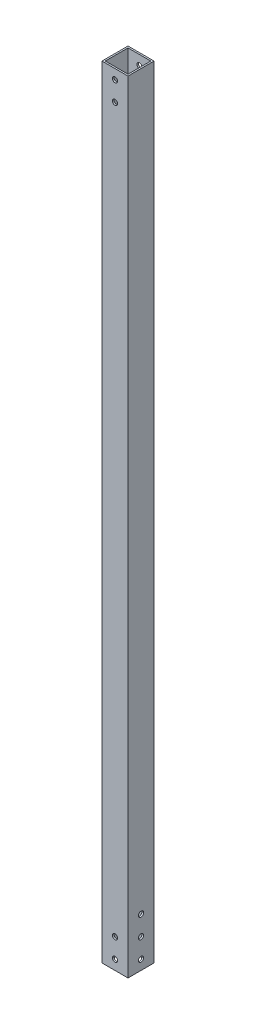
ISO-10303-21;
HEADER;
FILE_DESCRIPTION(('STEP AP214'),'2;1');
FILE_NAME('part.step','',(''),(''),'','','');
FILE_SCHEMA(('AUTOMOTIVE_DESIGN { 1 0 10303 214 1 1 1 1 }'));
ENDSEC;
DATA;
#1=APPLICATION_CONTEXT('core data for automotive mechanical design processes');
#2=APPLICATION_PROTOCOL_DEFINITION('international standard','automotive_design',2000,#1);
#3=PRODUCT_CONTEXT('',#1,'mechanical');
#4=PRODUCT('Part','Part','',(#3));
#5=PRODUCT_RELATED_PRODUCT_CATEGORY('part','',(#4));
#6=PRODUCT_DEFINITION_FORMATION('','',#4);
#7=PRODUCT_DEFINITION_CONTEXT('part definition',#1,'design');
#8=PRODUCT_DEFINITION('design','',#6,#7);
#9=PRODUCT_DEFINITION_SHAPE('','',#8);
#10=(LENGTH_UNIT() NAMED_UNIT(*) SI_UNIT(.MILLI.,.METRE.));
#11=(NAMED_UNIT(*) PLANE_ANGLE_UNIT() SI_UNIT($,.RADIAN.));
#12=(NAMED_UNIT(*) SI_UNIT($,.STERADIAN.) SOLID_ANGLE_UNIT());
#13=UNCERTAINTY_MEASURE_WITH_UNIT(LENGTH_MEASURE(1.E-05),#10,'distance_accuracy_value','');
#14=(GEOMETRIC_REPRESENTATION_CONTEXT(3) GLOBAL_UNCERTAINTY_ASSIGNED_CONTEXT((#13)) GLOBAL_UNIT_ASSIGNED_CONTEXT((#10,
#11,#12)) REPRESENTATION_CONTEXT('',''));
#15=CARTESIAN_POINT('',(0.,0.,0.));
#16=DIRECTION('',(0.,0.,1.));
#17=DIRECTION('',(1.,0.,0.));
#18=AXIS2_PLACEMENT_3D('',#15,#16,#17);
#19=CARTESIAN_POINT('',(0.,752.475,-12.7));
#20=DIRECTION('',(0.,0.,1.));
#21=DIRECTION('',(1.,0.,0.));
#22=AXIS2_PLACEMENT_3D('',#19,#20,#21);
#23=CYLINDRICAL_SURFACE('',#22,2.5527);
#24=CARTESIAN_POINT('',(0.,752.475,-11.1125));
#25=DIRECTION('',(0.,0.,1.));
#26=DIRECTION('',(1.,0.,0.));
#27=AXIS2_PLACEMENT_3D('',#24,#25,#26);
#28=CIRCLE('',#27,2.5527);
#29=CARTESIAN_POINT('',(2.5527,752.475,-11.1125));
#30=VERTEX_POINT('',#29);
#31=EDGE_CURVE('E313',#30,#30,#28,.T.);
#32=ORIENTED_EDGE('',*,*,#31,.T.);
#33=EDGE_LOOP('',(#32));
#34=FACE_BOUND('',#33,.T.);
#35=CARTESIAN_POINT('',(0.,752.475,-12.7));
#36=DIRECTION('',(0.,0.,1.));
#37=DIRECTION('',(1.,0.,0.));
#38=AXIS2_PLACEMENT_3D('',#35,#36,#37);
#39=CIRCLE('',#38,2.5527);
#40=CARTESIAN_POINT('',(2.5527,752.475,-12.7));
#41=VERTEX_POINT('',#40);
#42=EDGE_CURVE('E270',#41,#41,#39,.T.);
#43=ORIENTED_EDGE('',*,*,#42,.F.);
#44=EDGE_LOOP('',(#43));
#45=FACE_BOUND('',#44,.T.);
#46=ADVANCED_FACE('F17',(#34,#45),#23,.F.);
#47=CARTESIAN_POINT('',(0.,733.425,-12.7));
#48=DIRECTION('',(0.,0.,1.));
#49=DIRECTION('',(1.,0.,0.));
#50=AXIS2_PLACEMENT_3D('',#47,#48,#49);
#51=CYLINDRICAL_SURFACE('',#50,2.55270000000004);
#52=CARTESIAN_POINT('',(0.,733.425,-11.1125));
#53=DIRECTION('',(0.,0.,1.));
#54=DIRECTION('',(1.,0.,0.));
#55=AXIS2_PLACEMENT_3D('',#52,#53,#54);
#56=CIRCLE('',#55,2.55270000000004);
#57=CARTESIAN_POINT('',(2.55270000000004,733.425,-11.1125));
#58=VERTEX_POINT('',#57);
#59=EDGE_CURVE('E316',#58,#58,#56,.T.);
#60=ORIENTED_EDGE('',*,*,#59,.T.);
#61=EDGE_LOOP('',(#60));
#62=FACE_BOUND('',#61,.T.);
#63=CARTESIAN_POINT('',(0.,733.425,-12.7));
#64=DIRECTION('',(0.,0.,1.));
#65=DIRECTION('',(1.,0.,0.));
#66=AXIS2_PLACEMENT_3D('',#63,#64,#65);
#67=CIRCLE('',#66,2.55270000000004);
#68=CARTESIAN_POINT('',(2.55270000000004,733.425,-12.7));
#69=VERTEX_POINT('',#68);
#70=EDGE_CURVE('E266',#69,#69,#67,.T.);
#71=ORIENTED_EDGE('',*,*,#70,.F.);
#72=EDGE_LOOP('',(#71));
#73=FACE_BOUND('',#72,.T.);
#74=ADVANCED_FACE('F440',(#62,#73),#51,.F.);
#75=CARTESIAN_POINT('',(0.,752.475,-12.7));
#76=DIRECTION('',(0.,0.,1.));
#77=DIRECTION('',(1.,0.,0.));
#78=AXIS2_PLACEMENT_3D('',#75,#76,#77);
#79=CYLINDRICAL_SURFACE('',#78,2.5527);
#80=CARTESIAN_POINT('',(0.,752.475,11.1125));
#81=DIRECTION('',(0.,0.,-1.));
#82=DIRECTION('',(-1.,0.,0.));
#83=AXIS2_PLACEMENT_3D('',#80,#81,#82);
#84=CIRCLE('',#83,2.5527);
#85=CARTESIAN_POINT('',(-2.55270000000004,752.475,11.1125));
#86=VERTEX_POINT('',#85);
#87=EDGE_CURVE('E301',#86,#86,#84,.T.);
#88=ORIENTED_EDGE('',*,*,#87,.T.);
#89=EDGE_LOOP('',(#88));
#90=FACE_BOUND('',#89,.T.);
#91=CARTESIAN_POINT('',(0.,752.475,12.7));
#92=DIRECTION('',(0.,0.,1.));
#93=DIRECTION('',(1.,0.,0.));
#94=AXIS2_PLACEMENT_3D('',#91,#92,#93);
#95=CIRCLE('',#94,2.5527);
#96=CARTESIAN_POINT('',(2.5527,752.475,12.7));
#97=VERTEX_POINT('',#96);
#98=EDGE_CURVE('E309',#97,#97,#95,.T.);
#99=ORIENTED_EDGE('',*,*,#98,.T.);
#100=EDGE_LOOP('',(#99));
#101=FACE_BOUND('',#100,.T.);
#102=ADVANCED_FACE('F446',(#90,#101),#79,.F.);
#103=CARTESIAN_POINT('',(0.,733.425,-12.7));
#104=DIRECTION('',(0.,0.,1.));
#105=DIRECTION('',(1.,0.,0.));
#106=AXIS2_PLACEMENT_3D('',#103,#104,#105);
#107=CYLINDRICAL_SURFACE('',#106,2.55270000000004);
#108=CARTESIAN_POINT('',(0.,733.425,11.1125));
#109=DIRECTION('',(0.,0.,-1.));
#110=DIRECTION('',(-1.,0.,0.));
#111=AXIS2_PLACEMENT_3D('',#108,#109,#110);
#112=CIRCLE('',#111,2.55270000000004);
#113=CARTESIAN_POINT('',(-2.55270000000004,733.425,11.1125));
#114=VERTEX_POINT('',#113);
#115=EDGE_CURVE('E297',#114,#114,#112,.T.);
#116=ORIENTED_EDGE('',*,*,#115,.T.);
#117=EDGE_LOOP('',(#116));
#118=FACE_BOUND('',#117,.T.);
#119=CARTESIAN_POINT('',(0.,733.425,12.7));
#120=DIRECTION('',(0.,0.,1.));
#121=DIRECTION('',(1.,0.,0.));
#122=AXIS2_PLACEMENT_3D('',#119,#120,#121);
#123=CIRCLE('',#122,2.55270000000004);
#124=CARTESIAN_POINT('',(2.55270000000004,733.425,12.7));
#125=VERTEX_POINT('',#124);
#126=EDGE_CURVE('E208',#125,#125,#123,.T.);
#127=ORIENTED_EDGE('',*,*,#126,.T.);
#128=EDGE_LOOP('',(#127));
#129=FACE_BOUND('',#128,.T.);
#130=ADVANCED_FACE('F456',(#118,#129),#107,.F.);
#131=CARTESIAN_POINT('',(12.7,47.625,0.));
#132=DIRECTION('',(-1.,0.,0.));
#133=DIRECTION('',(0.,0.,1.));
#134=AXIS2_PLACEMENT_3D('',#131,#132,#133);
#135=CYLINDRICAL_SURFACE('',#134,2.5527);
#136=CARTESIAN_POINT('',(-11.1125,47.625,0.));
#137=DIRECTION('',(1.,0.,0.));
#138=DIRECTION('',(0.,0.,-1.));
#139=AXIS2_PLACEMENT_3D('',#136,#137,#138);
#140=CIRCLE('',#139,2.5527);
#141=CARTESIAN_POINT('',(-11.1125,47.625,-2.5527));
#142=VERTEX_POINT('',#141);
#143=EDGE_CURVE('E332',#142,#142,#140,.T.);
#144=ORIENTED_EDGE('',*,*,#143,.T.);
#145=EDGE_LOOP('',(#144));
#146=FACE_BOUND('',#145,.T.);
#147=CARTESIAN_POINT('',(-12.7,47.625,0.));
#148=DIRECTION('',(-1.,0.,0.));
#149=DIRECTION('',(0.,0.,1.));
#150=AXIS2_PLACEMENT_3D('',#147,#148,#149);
#151=CIRCLE('',#150,2.5527);
#152=CARTESIAN_POINT('',(-12.7,47.625,2.5527));
#153=VERTEX_POINT('',#152);
#154=EDGE_CURVE('E288',#153,#153,#151,.T.);
#155=ORIENTED_EDGE('',*,*,#154,.T.);
#156=EDGE_LOOP('',(#155));
#157=FACE_BOUND('',#156,.T.);
#158=ADVANCED_FACE('F509',(#146,#157),#135,.F.);
#159=CARTESIAN_POINT('',(12.7,47.625,0.));
#160=DIRECTION('',(-1.,0.,0.));
#161=DIRECTION('',(0.,0.,1.));
#162=AXIS2_PLACEMENT_3D('',#159,#160,#161);
#163=CYLINDRICAL_SURFACE('',#162,2.5527);
#164=CARTESIAN_POINT('',(11.1125,47.625,0.));
#165=DIRECTION('',(-1.,0.,0.));
#166=DIRECTION('',(0.,0.,1.));
#167=AXIS2_PLACEMENT_3D('',#164,#165,#166);
#168=CIRCLE('',#167,2.5527);
#169=CARTESIAN_POINT('',(11.1125,47.625,2.5527));
#170=VERTEX_POINT('',#169);
#171=EDGE_CURVE('E282',#170,#170,#168,.T.);
#172=ORIENTED_EDGE('',*,*,#171,.T.);
#173=EDGE_LOOP('',(#172));
#174=FACE_BOUND('',#173,.T.);
#175=CARTESIAN_POINT('',(12.7,47.625,0.));
#176=DIRECTION('',(-1.,0.,0.));
#177=DIRECTION('',(0.,0.,1.));
#178=AXIS2_PLACEMENT_3D('',#175,#176,#177);
#179=CIRCLE('',#178,2.5527);
#180=CARTESIAN_POINT('',(12.7,47.625,2.5527));
#181=VERTEX_POINT('',#180);
#182=EDGE_CURVE('E62',#181,#181,#179,.T.);
#183=ORIENTED_EDGE('',*,*,#182,.F.);
#184=EDGE_LOOP('',(#183));
#185=FACE_BOUND('',#184,.T.);
#186=ADVANCED_FACE('F504',(#174,#185),#163,.F.);
#187=CARTESIAN_POINT('',(12.7,28.575,0.));
#188=DIRECTION('',(-1.,0.,0.));
#189=DIRECTION('',(0.,0.,1.));
#190=AXIS2_PLACEMENT_3D('',#187,#188,#189);
#191=CYLINDRICAL_SURFACE('',#190,2.5527);
#192=CARTESIAN_POINT('',(-11.1125,28.575,0.));
#193=DIRECTION('',(1.,0.,0.));
#194=DIRECTION('',(0.,0.,-1.));
#195=AXIS2_PLACEMENT_3D('',#192,#193,#194);
#196=CIRCLE('',#195,2.5527);
#197=CARTESIAN_POINT('',(-11.1125,28.575,-2.5527));
#198=VERTEX_POINT('',#197);
#199=EDGE_CURVE('E340',#198,#198,#196,.T.);
#200=ORIENTED_EDGE('',*,*,#199,.T.);
#201=EDGE_LOOP('',(#200));
#202=FACE_BOUND('',#201,.T.);
#203=CARTESIAN_POINT('',(-12.7,28.575,0.));
#204=DIRECTION('',(-1.,0.,0.));
#205=DIRECTION('',(0.,0.,1.));
#206=AXIS2_PLACEMENT_3D('',#203,#204,#205);
#207=CIRCLE('',#206,2.5527);
#208=CARTESIAN_POINT('',(-12.7,28.575,2.5527));
#209=VERTEX_POINT('',#208);
#210=EDGE_CURVE('E291',#209,#209,#207,.T.);
#211=ORIENTED_EDGE('',*,*,#210,.T.);
#212=EDGE_LOOP('',(#211));
#213=FACE_BOUND('',#212,.T.);
#214=ADVANCED_FACE('F462',(#202,#213),#191,.F.);
#215=CARTESIAN_POINT('',(12.7,9.525,0.));
#216=DIRECTION('',(-1.,0.,0.));
#217=DIRECTION('',(0.,0.,1.));
#218=AXIS2_PLACEMENT_3D('',#215,#216,#217);
#219=CYLINDRICAL_SURFACE('',#218,2.5527);
#220=CARTESIAN_POINT('',(-11.1125,9.525,0.));
#221=DIRECTION('',(1.,0.,0.));
#222=DIRECTION('',(0.,0.,-1.));
#223=AXIS2_PLACEMENT_3D('',#220,#221,#222);
#224=CIRCLE('',#223,2.5527);
#225=CARTESIAN_POINT('',(-11.1125,9.525,-2.5527));
#226=VERTEX_POINT('',#225);
#227=EDGE_CURVE('E337',#226,#226,#224,.T.);
#228=ORIENTED_EDGE('',*,*,#227,.T.);
#229=EDGE_LOOP('',(#228));
#230=FACE_BOUND('',#229,.T.);
#231=CARTESIAN_POINT('',(-12.7,9.525,0.));
#232=DIRECTION('',(-1.,0.,0.));
#233=DIRECTION('',(0.,0.,1.));
#234=AXIS2_PLACEMENT_3D('',#231,#232,#233);
#235=CIRCLE('',#234,2.5527);
#236=CARTESIAN_POINT('',(-12.7,9.525,2.5527));
#237=VERTEX_POINT('',#236);
#238=EDGE_CURVE('E296',#237,#237,#235,.T.);
#239=ORIENTED_EDGE('',*,*,#238,.T.);
#240=EDGE_LOOP('',(#239));
#241=FACE_BOUND('',#240,.T.);
#242=ADVANCED_FACE('F458',(#230,#241),#219,.F.);
#243=CARTESIAN_POINT('',(12.7,28.575,0.));
#244=DIRECTION('',(-1.,0.,0.));
#245=DIRECTION('',(0.,0.,1.));
#246=AXIS2_PLACEMENT_3D('',#243,#244,#245);
#247=CYLINDRICAL_SURFACE('',#246,2.5527);
#248=CARTESIAN_POINT('',(11.1125,28.575,0.));
#249=DIRECTION('',(-1.,0.,0.));
#250=DIRECTION('',(0.,0.,1.));
#251=AXIS2_PLACEMENT_3D('',#248,#249,#250);
#252=CIRCLE('',#251,2.5527);
#253=CARTESIAN_POINT('',(11.1125,28.575,2.5527));
#254=VERTEX_POINT('',#253);
#255=EDGE_CURVE('E28',#254,#254,#252,.T.);
#256=ORIENTED_EDGE('',*,*,#255,.T.);
#257=EDGE_LOOP('',(#256));
#258=FACE_BOUND('',#257,.T.);
#259=CARTESIAN_POINT('',(12.7,28.575,0.));
#260=DIRECTION('',(-1.,0.,0.));
#261=DIRECTION('',(0.,0.,1.));
#262=AXIS2_PLACEMENT_3D('',#259,#260,#261);
#263=CIRCLE('',#262,2.5527);
#264=CARTESIAN_POINT('',(12.7,28.575,2.5527));
#265=VERTEX_POINT('',#264);
#266=EDGE_CURVE('E312',#265,#265,#263,.T.);
#267=ORIENTED_EDGE('',*,*,#266,.F.);
#268=EDGE_LOOP('',(#267));
#269=FACE_BOUND('',#268,.T.);
#270=ADVANCED_FACE('F461',(#258,#269),#247,.F.);
#271=CARTESIAN_POINT('',(12.7,9.525,0.));
#272=DIRECTION('',(-1.,0.,0.));
#273=DIRECTION('',(0.,0.,1.));
#274=AXIS2_PLACEMENT_3D('',#271,#272,#273);
#275=CYLINDRICAL_SURFACE('',#274,2.5527);
#276=CARTESIAN_POINT('',(11.1125,9.525,0.));
#277=DIRECTION('',(-1.,0.,0.));
#278=DIRECTION('',(0.,0.,1.));
#279=AXIS2_PLACEMENT_3D('',#276,#277,#278);
#280=CIRCLE('',#279,2.5527);
#281=CARTESIAN_POINT('',(11.1125,9.525,2.5527));
#282=VERTEX_POINT('',#281);
#283=EDGE_CURVE('E11',#282,#282,#280,.T.);
#284=ORIENTED_EDGE('',*,*,#283,.T.);
#285=EDGE_LOOP('',(#284));
#286=FACE_BOUND('',#285,.T.);
#287=CARTESIAN_POINT('',(12.7,9.525,0.));
#288=DIRECTION('',(-1.,0.,0.));
#289=DIRECTION('',(0.,0.,1.));
#290=AXIS2_PLACEMENT_3D('',#287,#288,#289);
#291=CIRCLE('',#290,2.5527);
#292=CARTESIAN_POINT('',(12.7,9.525,2.5527));
#293=VERTEX_POINT('',#292);
#294=EDGE_CURVE('E21',#293,#293,#291,.T.);
#295=ORIENTED_EDGE('',*,*,#294,.F.);
#296=EDGE_LOOP('',(#295));
#297=FACE_BOUND('',#296,.T.);
#298=ADVANCED_FACE('F501',(#286,#297),#275,.F.);
#299=CARTESIAN_POINT('',(0.,9.525,-12.7));
#300=DIRECTION('',(0.,0.,1.));
#301=DIRECTION('',(1.,0.,0.));
#302=AXIS2_PLACEMENT_3D('',#299,#300,#301);
#303=CYLINDRICAL_SURFACE('',#302,2.5527);
#304=CARTESIAN_POINT('',(0.,9.525,-11.1125));
#305=DIRECTION('',(0.,0.,1.));
#306=DIRECTION('',(1.,0.,0.));
#307=AXIS2_PLACEMENT_3D('',#304,#305,#306);
#308=CIRCLE('',#307,2.5527);
#309=CARTESIAN_POINT('',(2.5527,9.525,-11.1125));
#310=VERTEX_POINT('',#309);
#311=EDGE_CURVE('E279',#310,#310,#308,.T.);
#312=ORIENTED_EDGE('',*,*,#311,.T.);
#313=EDGE_LOOP('',(#312));
#314=FACE_BOUND('',#313,.T.);
#315=CARTESIAN_POINT('',(0.,9.525,-12.7));
#316=DIRECTION('',(0.,0.,1.));
#317=DIRECTION('',(1.,0.,0.));
#318=AXIS2_PLACEMENT_3D('',#315,#316,#317);
#319=CIRCLE('',#318,2.5527);
#320=CARTESIAN_POINT('',(2.5527,9.525,-12.7));
#321=VERTEX_POINT('',#320);
#322=EDGE_CURVE('E269',#321,#321,#319,.T.);
#323=ORIENTED_EDGE('',*,*,#322,.F.);
#324=EDGE_LOOP('',(#323));
#325=FACE_BOUND('',#324,.T.);
#326=ADVANCED_FACE('F474',(#314,#325),#303,.F.);
#327=CARTESIAN_POINT('',(0.,28.575,-12.7));
#328=DIRECTION('',(0.,0.,1.));
#329=DIRECTION('',(1.,0.,0.));
#330=AXIS2_PLACEMENT_3D('',#327,#328,#329);
#331=CYLINDRICAL_SURFACE('',#330,2.5527);
#332=CARTESIAN_POINT('',(0.,28.575,-11.1125));
#333=DIRECTION('',(0.,0.,1.));
#334=DIRECTION('',(1.,0.,0.));
#335=AXIS2_PLACEMENT_3D('',#332,#333,#334);
#336=CIRCLE('',#335,2.5527);
#337=CARTESIAN_POINT('',(2.5527,28.575,-11.1125));
#338=VERTEX_POINT('',#337);
#339=EDGE_CURVE('E275',#338,#338,#336,.T.);
#340=ORIENTED_EDGE('',*,*,#339,.T.);
#341=EDGE_LOOP('',(#340));
#342=FACE_BOUND('',#341,.T.);
#343=CARTESIAN_POINT('',(0.,28.575,-12.7));
#344=DIRECTION('',(0.,0.,1.));
#345=DIRECTION('',(1.,0.,0.));
#346=AXIS2_PLACEMENT_3D('',#343,#344,#345);
#347=CIRCLE('',#346,2.5527);
#348=CARTESIAN_POINT('',(2.5527,28.575,-12.7));
#349=VERTEX_POINT('',#348);
#350=EDGE_CURVE('E320',#349,#349,#347,.T.);
#351=ORIENTED_EDGE('',*,*,#350,.F.);
#352=EDGE_LOOP('',(#351));
#353=FACE_BOUND('',#352,.T.);
#354=ADVANCED_FACE('F19',(#342,#353),#331,.F.);
#355=CARTESIAN_POINT('',(0.,9.525,-12.7));
#356=DIRECTION('',(0.,0.,1.));
#357=DIRECTION('',(1.,0.,0.));
#358=AXIS2_PLACEMENT_3D('',#355,#356,#357);
#359=CYLINDRICAL_SURFACE('',#358,2.5527);
#360=CARTESIAN_POINT('',(0.,9.525,11.1125));
#361=DIRECTION('',(0.,0.,-1.));
#362=DIRECTION('',(-1.,0.,0.));
#363=AXIS2_PLACEMENT_3D('',#360,#361,#362);
#364=CIRCLE('',#363,2.5527);
#365=CARTESIAN_POINT('',(-2.5527,9.525,11.1125));
#366=VERTEX_POINT('',#365);
#367=EDGE_CURVE('E283',#366,#366,#364,.T.);
#368=ORIENTED_EDGE('',*,*,#367,.T.);
#369=EDGE_LOOP('',(#368));
#370=FACE_BOUND('',#369,.T.);
#371=CARTESIAN_POINT('',(0.,9.525,12.7));
#372=DIRECTION('',(0.,0.,1.));
#373=DIRECTION('',(1.,0.,0.));
#374=AXIS2_PLACEMENT_3D('',#371,#372,#373);
#375=CIRCLE('',#374,2.5527);
#376=CARTESIAN_POINT('',(2.5527,9.525,12.7));
#377=VERTEX_POINT('',#376);
#378=EDGE_CURVE('E198',#377,#377,#375,.T.);
#379=ORIENTED_EDGE('',*,*,#378,.T.);
#380=EDGE_LOOP('',(#379));
#381=FACE_BOUND('',#380,.T.);
#382=ADVANCED_FACE('F465',(#370,#381),#359,.F.);
#383=CARTESIAN_POINT('',(0.,28.575,-12.7));
#384=DIRECTION('',(0.,0.,1.));
#385=DIRECTION('',(1.,0.,0.));
#386=AXIS2_PLACEMENT_3D('',#383,#384,#385);
#387=CYLINDRICAL_SURFACE('',#386,2.5527);
#388=CARTESIAN_POINT('',(0.,28.575,11.1125));
#389=DIRECTION('',(0.,0.,-1.));
#390=DIRECTION('',(-1.,0.,0.));
#391=AXIS2_PLACEMENT_3D('',#388,#389,#390);
#392=CIRCLE('',#391,2.5527);
#393=CARTESIAN_POINT('',(-2.5527,28.575,11.1125));
#394=VERTEX_POINT('',#393);
#395=EDGE_CURVE('E280',#394,#394,#392,.T.);
#396=ORIENTED_EDGE('',*,*,#395,.T.);
#397=EDGE_LOOP('',(#396));
#398=FACE_BOUND('',#397,.T.);
#399=CARTESIAN_POINT('',(0.,28.575,12.7));
#400=DIRECTION('',(0.,0.,1.));
#401=DIRECTION('',(1.,0.,0.));
#402=AXIS2_PLACEMENT_3D('',#399,#400,#401);
#403=CIRCLE('',#402,2.5527);
#404=CARTESIAN_POINT('',(2.5527,28.575,12.7));
#405=VERTEX_POINT('',#404);
#406=EDGE_CURVE('E329',#405,#405,#403,.T.);
#407=ORIENTED_EDGE('',*,*,#406,.T.);
#408=EDGE_LOOP('',(#407));
#409=FACE_BOUND('',#408,.T.);
#410=ADVANCED_FACE('F432',(#398,#409),#387,.F.);
#411=CARTESIAN_POINT('',(11.1125,762.,-11.1125));
#412=DIRECTION('',(-1.,0.,0.));
#413=DIRECTION('',(0.,1.,0.));
#414=AXIS2_PLACEMENT_3D('',#411,#412,#413);
#415=PLANE('',#414);
#416=ORIENTED_EDGE('',*,*,#283,.F.);
#417=EDGE_LOOP('',(#416));
#418=FACE_BOUND('',#417,.T.);
#419=ORIENTED_EDGE('',*,*,#255,.F.);
#420=EDGE_LOOP('',(#419));
#421=FACE_BOUND('',#420,.T.);
#422=ORIENTED_EDGE('',*,*,#171,.F.);
#423=EDGE_LOOP('',(#422));
#424=FACE_BOUND('',#423,.T.);
#425=DIRECTION('',(0.,0.,-1.));
#426=VECTOR('',#425,1.);
#427=CARTESIAN_POINT('',(11.1125,0.,-11.1125));
#428=LINE('',#427,#426);
#429=CARTESIAN_POINT('',(11.1125,0.,11.1125));
#430=VERTEX_POINT('',#429);
#431=CARTESIAN_POINT('',(11.1125,0.,-11.1125));
#432=VERTEX_POINT('',#431);
#433=EDGE_CURVE('E287',#430,#432,#428,.T.);
#434=ORIENTED_EDGE('',*,*,#433,.F.);
#435=DIRECTION('',(0.,-1.,0.));
#436=VECTOR('',#435,1.);
#437=CARTESIAN_POINT('',(11.1125,762.,11.1125));
#438=LINE('',#437,#436);
#439=CARTESIAN_POINT('',(11.1125,762.,11.1125));
#440=VERTEX_POINT('',#439);
#441=EDGE_CURVE('E79',#440,#430,#438,.T.);
#442=ORIENTED_EDGE('',*,*,#441,.F.);
#443=DIRECTION('',(0.,0.,-1.));
#444=VECTOR('',#443,1.);
#445=CARTESIAN_POINT('',(11.1125,762.,-11.1125));
#446=LINE('',#445,#444);
#447=CARTESIAN_POINT('',(11.1125,762.,-11.1125));
#448=VERTEX_POINT('',#447);
#449=EDGE_CURVE('E336',#440,#448,#446,.T.);
#450=ORIENTED_EDGE('',*,*,#449,.T.);
#451=DIRECTION('',(0.,-1.,0.));
#452=VECTOR('',#451,1.);
#453=CARTESIAN_POINT('',(11.1125,762.,-11.1125));
#454=LINE('',#453,#452);
#455=EDGE_CURVE('E326',#448,#432,#454,.T.);
#456=ORIENTED_EDGE('',*,*,#455,.T.);
#457=EDGE_LOOP('',(#434,#442,#450,#456));
#458=FACE_BOUND('',#457,.T.);
#459=ADVANCED_FACE('F422',(#418,#421,#424,#458),#415,.T.);
#460=CARTESIAN_POINT('',(-11.1125,762.,11.1125));
#461=DIRECTION('',(0.,0.,-1.));
#462=DIRECTION('',(0.,-1.,0.));
#463=AXIS2_PLACEMENT_3D('',#460,#461,#462);
#464=PLANE('',#463);
#465=ORIENTED_EDGE('',*,*,#395,.F.);
#466=EDGE_LOOP('',(#465));
#467=FACE_BOUND('',#466,.T.);
#468=ORIENTED_EDGE('',*,*,#367,.F.);
#469=EDGE_LOOP('',(#468));
#470=FACE_BOUND('',#469,.T.);
#471=ORIENTED_EDGE('',*,*,#115,.F.);
#472=EDGE_LOOP('',(#471));
#473=FACE_BOUND('',#472,.T.);
#474=ORIENTED_EDGE('',*,*,#87,.F.);
#475=EDGE_LOOP('',(#474));
#476=FACE_BOUND('',#475,.T.);
#477=DIRECTION('',(1.,0.,0.));
#478=VECTOR('',#477,1.);
#479=CARTESIAN_POINT('',(-11.1125,0.,11.1125));
#480=LINE('',#479,#478);
#481=CARTESIAN_POINT('',(-11.1125,0.,11.1125));
#482=VERTEX_POINT('',#481);
#483=EDGE_CURVE('E347',#482,#430,#480,.T.);
#484=ORIENTED_EDGE('',*,*,#483,.F.);
#485=DIRECTION('',(0.,-1.,0.));
#486=VECTOR('',#485,1.);
#487=CARTESIAN_POINT('',(-11.1125,762.,11.1125));
#488=LINE('',#487,#486);
#489=CARTESIAN_POINT('',(-11.1125,762.,11.1125));
#490=VERTEX_POINT('',#489);
#491=EDGE_CURVE('E278',#490,#482,#488,.T.);
#492=ORIENTED_EDGE('',*,*,#491,.F.);
#493=DIRECTION('',(1.,0.,0.));
#494=VECTOR('',#493,1.);
#495=CARTESIAN_POINT('',(-11.1125,762.,11.1125));
#496=LINE('',#495,#494);
#497=EDGE_CURVE('E346',#490,#440,#496,.T.);
#498=ORIENTED_EDGE('',*,*,#497,.T.);
#499=ORIENTED_EDGE('',*,*,#441,.T.);
#500=EDGE_LOOP('',(#484,#492,#498,#499));
#501=FACE_BOUND('',#500,.T.);
#502=ADVANCED_FACE('F420',(#467,#470,#473,#476,#501),#464,.T.);
#503=CARTESIAN_POINT('',(-11.1125,762.,-11.1125));
#504=DIRECTION('',(1.,0.,0.));
#505=DIRECTION('',(0.,0.,-1.));
#506=AXIS2_PLACEMENT_3D('',#503,#504,#505);
#507=PLANE('',#506);
#508=ORIENTED_EDGE('',*,*,#227,.F.);
#509=EDGE_LOOP('',(#508));
#510=FACE_BOUND('',#509,.T.);
#511=ORIENTED_EDGE('',*,*,#199,.F.);
#512=EDGE_LOOP('',(#511));
#513=FACE_BOUND('',#512,.T.);
#514=ORIENTED_EDGE('',*,*,#143,.F.);
#515=EDGE_LOOP('',(#514));
#516=FACE_BOUND('',#515,.T.);
#517=DIRECTION('',(0.,0.,1.));
#518=VECTOR('',#517,1.);
#519=CARTESIAN_POINT('',(-11.1125,0.,-11.1125));
#520=LINE('',#519,#518);
#521=CARTESIAN_POINT('',(-11.1125,0.,-11.1125));
#522=VERTEX_POINT('',#521);
#523=EDGE_CURVE('E351',#522,#482,#520,.T.);
#524=ORIENTED_EDGE('',*,*,#523,.F.);
#525=DIRECTION('',(0.,-1.,0.));
#526=VECTOR('',#525,1.);
#527=CARTESIAN_POINT('',(-11.1125,762.,-11.1125));
#528=LINE('',#527,#526);
#529=CARTESIAN_POINT('',(-11.1125,762.,-11.1125));
#530=VERTEX_POINT('',#529);
#531=EDGE_CURVE('E317',#530,#522,#528,.T.);
#532=ORIENTED_EDGE('',*,*,#531,.F.);
#533=DIRECTION('',(0.,0.,1.));
#534=VECTOR('',#533,1.);
#535=CARTESIAN_POINT('',(-11.1125,762.,-11.1125));
#536=LINE('',#535,#534);
#537=EDGE_CURVE('E253',#530,#490,#536,.T.);
#538=ORIENTED_EDGE('',*,*,#537,.T.);
#539=ORIENTED_EDGE('',*,*,#491,.T.);
#540=EDGE_LOOP('',(#524,#532,#538,#539));
#541=FACE_BOUND('',#540,.T.);
#542=ADVANCED_FACE('F418',(#510,#513,#516,#541),#507,.T.);
#543=CARTESIAN_POINT('',(-11.1125,762.,-11.1125));
#544=DIRECTION('',(0.,0.,1.));
#545=DIRECTION('',(1.,0.,0.));
#546=AXIS2_PLACEMENT_3D('',#543,#544,#545);
#547=PLANE('',#546);
#548=ORIENTED_EDGE('',*,*,#339,.F.);
#549=EDGE_LOOP('',(#548));
#550=FACE_BOUND('',#549,.T.);
#551=ORIENTED_EDGE('',*,*,#311,.F.);
#552=EDGE_LOOP('',(#551));
#553=FACE_BOUND('',#552,.T.);
#554=ORIENTED_EDGE('',*,*,#59,.F.);
#555=EDGE_LOOP('',(#554));
#556=FACE_BOUND('',#555,.T.);
#557=ORIENTED_EDGE('',*,*,#31,.F.);
#558=EDGE_LOOP('',(#557));
#559=FACE_BOUND('',#558,.T.);
#560=DIRECTION('',(-1.,0.,0.));
#561=VECTOR('',#560,1.);
#562=CARTESIAN_POINT('',(-11.1125,0.,-11.1125));
#563=LINE('',#562,#561);
#564=EDGE_CURVE('E385',#432,#522,#563,.T.);
#565=ORIENTED_EDGE('',*,*,#564,.F.);
#566=ORIENTED_EDGE('',*,*,#455,.F.);
#567=DIRECTION('',(-1.,0.,0.));
#568=VECTOR('',#567,1.);
#569=CARTESIAN_POINT('',(-11.1125,762.,-11.1125));
#570=LINE('',#569,#568);
#571=EDGE_CURVE('E274',#448,#530,#570,.T.);
#572=ORIENTED_EDGE('',*,*,#571,.T.);
#573=ORIENTED_EDGE('',*,*,#531,.T.);
#574=EDGE_LOOP('',(#565,#566,#572,#573));
#575=FACE_BOUND('',#574,.T.);
#576=ADVANCED_FACE('F413',(#550,#553,#556,#559,#575),#547,.T.);
#577=CARTESIAN_POINT('',(-12.7,762.,12.7));
#578=DIRECTION('',(0.,0.,-1.));
#579=DIRECTION('',(0.,-1.,0.));
#580=AXIS2_PLACEMENT_3D('',#577,#578,#579);
#581=PLANE('',#580);
#582=ORIENTED_EDGE('',*,*,#406,.F.);
#583=EDGE_LOOP('',(#582));
#584=FACE_BOUND('',#583,.T.);
#585=ORIENTED_EDGE('',*,*,#378,.F.);
#586=EDGE_LOOP('',(#585));
#587=FACE_BOUND('',#586,.T.);
#588=ORIENTED_EDGE('',*,*,#126,.F.);
#589=EDGE_LOOP('',(#588));
#590=FACE_BOUND('',#589,.T.);
#591=ORIENTED_EDGE('',*,*,#98,.F.);
#592=EDGE_LOOP('',(#591));
#593=FACE_BOUND('',#592,.T.);
#594=DIRECTION('',(1.,0.,0.));
#595=VECTOR('',#594,1.);
#596=CARTESIAN_POINT('',(-12.7,0.,12.7));
#597=LINE('',#596,#595);
#598=CARTESIAN_POINT('',(-12.7,0.,12.7));
#599=VERTEX_POINT('',#598);
#600=CARTESIAN_POINT('',(12.7,0.,12.7));
#601=VERTEX_POINT('',#600);
#602=EDGE_CURVE('E237',#599,#601,#597,.T.);
#603=ORIENTED_EDGE('',*,*,#602,.T.);
#604=DIRECTION('',(0.,-1.,0.));
#605=VECTOR('',#604,1.);
#606=CARTESIAN_POINT('',(12.7,762.,12.7));
#607=LINE('',#606,#605);
#608=CARTESIAN_POINT('',(12.7,762.,12.7));
#609=VERTEX_POINT('',#608);
#610=EDGE_CURVE('E231',#609,#601,#607,.T.);
#611=ORIENTED_EDGE('',*,*,#610,.F.);
#612=DIRECTION('',(1.,0.,0.));
#613=VECTOR('',#612,1.);
#614=CARTESIAN_POINT('',(-12.7,762.,12.7));
#615=LINE('',#614,#613);
#616=CARTESIAN_POINT('',(-12.7,762.,12.7));
#617=VERTEX_POINT('',#616);
#618=EDGE_CURVE('E234',#617,#609,#615,.T.);
#619=ORIENTED_EDGE('',*,*,#618,.F.);
#620=DIRECTION('',(0.,-1.,0.));
#621=VECTOR('',#620,1.);
#622=CARTESIAN_POINT('',(-12.7,762.,12.7));
#623=LINE('',#622,#621);
#624=EDGE_CURVE('E292',#617,#599,#623,.T.);
#625=ORIENTED_EDGE('',*,*,#624,.T.);
#626=EDGE_LOOP('',(#603,#611,#619,#625));
#627=FACE_BOUND('',#626,.T.);
#628=ADVANCED_FACE('F233',(#584,#587,#590,#593,#627),#581,.F.);
#629=CARTESIAN_POINT('',(-12.7,762.,-12.7));
#630=DIRECTION('',(1.,0.,0.));
#631=DIRECTION('',(0.,0.,-1.));
#632=AXIS2_PLACEMENT_3D('',#629,#630,#631);
#633=PLANE('',#632);
#634=ORIENTED_EDGE('',*,*,#238,.F.);
#635=EDGE_LOOP('',(#634));
#636=FACE_BOUND('',#635,.T.);
#637=ORIENTED_EDGE('',*,*,#210,.F.);
#638=EDGE_LOOP('',(#637));
#639=FACE_BOUND('',#638,.T.);
#640=ORIENTED_EDGE('',*,*,#154,.F.);
#641=EDGE_LOOP('',(#640));
#642=FACE_BOUND('',#641,.T.);
#643=DIRECTION('',(0.,0.,1.));
#644=VECTOR('',#643,1.);
#645=CARTESIAN_POINT('',(-12.7,0.,-12.7));
#646=LINE('',#645,#644);
#647=CARTESIAN_POINT('',(-12.7,0.,-12.7));
#648=VERTEX_POINT('',#647);
#649=EDGE_CURVE('E371',#648,#599,#646,.T.);
#650=ORIENTED_EDGE('',*,*,#649,.T.);
#651=ORIENTED_EDGE('',*,*,#624,.F.);
#652=DIRECTION('',(0.,0.,1.));
#653=VECTOR('',#652,1.);
#654=CARTESIAN_POINT('',(-12.7,762.,-12.7));
#655=LINE('',#654,#653);
#656=CARTESIAN_POINT('',(-12.7,762.,-12.7));
#657=VERTEX_POINT('',#656);
#658=EDGE_CURVE('E251',#657,#617,#655,.T.);
#659=ORIENTED_EDGE('',*,*,#658,.F.);
#660=DIRECTION('',(0.,-1.,0.));
#661=VECTOR('',#660,1.);
#662=CARTESIAN_POINT('',(-12.7,762.,-12.7));
#663=LINE('',#662,#661);
#664=EDGE_CURVE('E304',#657,#648,#663,.T.);
#665=ORIENTED_EDGE('',*,*,#664,.T.);
#666=EDGE_LOOP('',(#650,#651,#659,#665));
#667=FACE_BOUND('',#666,.T.);
#668=ADVANCED_FACE('F485',(#636,#639,#642,#667),#633,.F.);
#669=CARTESIAN_POINT('',(-12.7,762.,-12.7));
#670=DIRECTION('',(0.,0.,1.));
#671=DIRECTION('',(1.,0.,0.));
#672=AXIS2_PLACEMENT_3D('',#669,#670,#671);
#673=PLANE('',#672);
#674=ORIENTED_EDGE('',*,*,#350,.T.);
#675=EDGE_LOOP('',(#674));
#676=FACE_BOUND('',#675,.T.);
#677=ORIENTED_EDGE('',*,*,#322,.T.);
#678=EDGE_LOOP('',(#677));
#679=FACE_BOUND('',#678,.T.);
#680=ORIENTED_EDGE('',*,*,#70,.T.);
#681=EDGE_LOOP('',(#680));
#682=FACE_BOUND('',#681,.T.);
#683=ORIENTED_EDGE('',*,*,#42,.T.);
#684=EDGE_LOOP('',(#683));
#685=FACE_BOUND('',#684,.T.);
#686=DIRECTION('',(-1.,0.,0.));
#687=VECTOR('',#686,1.);
#688=CARTESIAN_POINT('',(-12.7,0.,-12.7));
#689=LINE('',#688,#687);
#690=CARTESIAN_POINT('',(12.7,0.,-12.7));
#691=VERTEX_POINT('',#690);
#692=EDGE_CURVE('E381',#691,#648,#689,.T.);
#693=ORIENTED_EDGE('',*,*,#692,.T.);
#694=ORIENTED_EDGE('',*,*,#664,.F.);
#695=DIRECTION('',(-1.,0.,0.));
#696=VECTOR('',#695,1.);
#697=CARTESIAN_POINT('',(-12.7,762.,-12.7));
#698=LINE('',#697,#696);
#699=CARTESIAN_POINT('',(12.7,762.,-12.7));
#700=VERTEX_POINT('',#699);
#701=EDGE_CURVE('E258',#700,#657,#698,.T.);
#702=ORIENTED_EDGE('',*,*,#701,.F.);
#703=DIRECTION('',(0.,-1.,0.));
#704=VECTOR('',#703,1.);
#705=CARTESIAN_POINT('',(12.7,762.,-12.7));
#706=LINE('',#705,#704);
#707=EDGE_CURVE('E243',#700,#691,#706,.T.);
#708=ORIENTED_EDGE('',*,*,#707,.T.);
#709=EDGE_LOOP('',(#693,#694,#702,#708));
#710=FACE_BOUND('',#709,.T.);
#711=ADVANCED_FACE('F491',(#676,#679,#682,#685,#710),#673,.F.);
#712=CARTESIAN_POINT('',(12.7,762.,-12.7));
#713=DIRECTION('',(-1.,0.,0.));
#714=DIRECTION('',(0.,0.,1.));
#715=AXIS2_PLACEMENT_3D('',#712,#713,#714);
#716=PLANE('',#715);
#717=ORIENTED_EDGE('',*,*,#294,.T.);
#718=EDGE_LOOP('',(#717));
#719=FACE_BOUND('',#718,.T.);
#720=ORIENTED_EDGE('',*,*,#266,.T.);
#721=EDGE_LOOP('',(#720));
#722=FACE_BOUND('',#721,.T.);
#723=ORIENTED_EDGE('',*,*,#182,.T.);
#724=EDGE_LOOP('',(#723));
#725=FACE_BOUND('',#724,.T.);
#726=DIRECTION('',(0.,0.,-1.));
#727=VECTOR('',#726,1.);
#728=CARTESIAN_POINT('',(12.7,0.,-12.7));
#729=LINE('',#728,#727);
#730=EDGE_CURVE('E343',#601,#691,#729,.T.);
#731=ORIENTED_EDGE('',*,*,#730,.T.);
#732=ORIENTED_EDGE('',*,*,#707,.F.);
#733=DIRECTION('',(0.,0.,-1.));
#734=VECTOR('',#733,1.);
#735=CARTESIAN_POINT('',(12.7,762.,-12.7));
#736=LINE('',#735,#734);
#737=EDGE_CURVE('E249',#609,#700,#736,.T.);
#738=ORIENTED_EDGE('',*,*,#737,.F.);
#739=ORIENTED_EDGE('',*,*,#610,.T.);
#740=EDGE_LOOP('',(#731,#732,#738,#739));
#741=FACE_BOUND('',#740,.T.);
#742=ADVANCED_FACE('F255',(#719,#722,#725,#741),#716,.F.);
#743=CARTESIAN_POINT('',(0.,0.,0.));
#744=DIRECTION('',(0.,1.,0.));
#745=DIRECTION('',(1.,0.,0.));
#746=AXIS2_PLACEMENT_3D('',#743,#744,#745);
#747=PLANE('',#746);
#748=ORIENTED_EDGE('',*,*,#564,.T.);
#749=ORIENTED_EDGE('',*,*,#523,.T.);
#750=ORIENTED_EDGE('',*,*,#483,.T.);
#751=ORIENTED_EDGE('',*,*,#433,.T.);
#752=EDGE_LOOP('',(#748,#749,#750,#751));
#753=FACE_BOUND('',#752,.T.);
#754=ORIENTED_EDGE('',*,*,#730,.F.);
#755=ORIENTED_EDGE('',*,*,#602,.F.);
#756=ORIENTED_EDGE('',*,*,#649,.F.);
#757=ORIENTED_EDGE('',*,*,#692,.F.);
#758=EDGE_LOOP('',(#754,#755,#756,#757));
#759=FACE_BOUND('',#758,.T.);
#760=ADVANCED_FACE('F409',(#753,#759),#747,.F.);
#761=CARTESIAN_POINT('',(0.,762.,0.));
#762=DIRECTION('',(0.,1.,0.));
#763=DIRECTION('',(1.,0.,0.));
#764=AXIS2_PLACEMENT_3D('',#761,#762,#763);
#765=PLANE('',#764);
#766=ORIENTED_EDGE('',*,*,#537,.F.);
#767=ORIENTED_EDGE('',*,*,#571,.F.);
#768=ORIENTED_EDGE('',*,*,#449,.F.);
#769=ORIENTED_EDGE('',*,*,#497,.F.);
#770=EDGE_LOOP('',(#766,#767,#768,#769));
#771=FACE_BOUND('',#770,.T.);
#772=ORIENTED_EDGE('',*,*,#737,.T.);
#773=ORIENTED_EDGE('',*,*,#701,.T.);
#774=ORIENTED_EDGE('',*,*,#658,.T.);
#775=ORIENTED_EDGE('',*,*,#618,.T.);
#776=EDGE_LOOP('',(#772,#773,#774,#775));
#777=FACE_BOUND('',#776,.T.);
#778=ADVANCED_FACE('F247',(#771,#777),#765,.T.);
#779=CLOSED_SHELL('',(#46,#74,#102,#130,#158,#186,#214,#242,#270,#298,#326,#354,#382,#410,#459,
#502,#542,#576,#628,#668,#711,#742,#760,#778));
#780=MANIFOLD_SOLID_BREP('B1',#779);
#781=ADVANCED_BREP_SHAPE_REPRESENTATION('',(#18,#780),#14);
#782=SHAPE_DEFINITION_REPRESENTATION(#9,#781);
ENDSEC;
END-ISO-10303-21;
